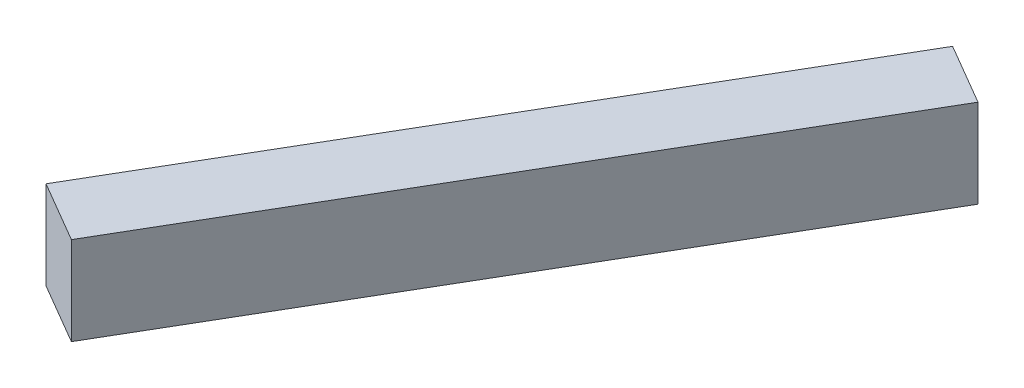
ISO-10303-21;
HEADER;
FILE_DESCRIPTION(('STEP AP214'),'2;1');
FILE_NAME('part.step','',(''),(''),'','','');
FILE_SCHEMA(('AUTOMOTIVE_DESIGN { 1 0 10303 214 1 1 1 1 }'));
ENDSEC;
DATA;
#1=APPLICATION_CONTEXT('core data for automotive mechanical design processes');
#2=APPLICATION_PROTOCOL_DEFINITION('international standard','automotive_design',2000,#1);
#3=PRODUCT_CONTEXT('',#1,'mechanical');
#4=PRODUCT('Part','Part','',(#3));
#5=PRODUCT_RELATED_PRODUCT_CATEGORY('part','',(#4));
#6=PRODUCT_DEFINITION_FORMATION('','',#4);
#7=PRODUCT_DEFINITION_CONTEXT('part definition',#1,'design');
#8=PRODUCT_DEFINITION('design','',#6,#7);
#9=PRODUCT_DEFINITION_SHAPE('','',#8);
#10=(LENGTH_UNIT() NAMED_UNIT(*) SI_UNIT(.MILLI.,.METRE.));
#11=(NAMED_UNIT(*) PLANE_ANGLE_UNIT() SI_UNIT($,.RADIAN.));
#12=(NAMED_UNIT(*) SI_UNIT($,.STERADIAN.) SOLID_ANGLE_UNIT());
#13=UNCERTAINTY_MEASURE_WITH_UNIT(LENGTH_MEASURE(1.E-05),#10,'distance_accuracy_value','');
#14=(GEOMETRIC_REPRESENTATION_CONTEXT(3) GLOBAL_UNCERTAINTY_ASSIGNED_CONTEXT((#13)) GLOBAL_UNIT_ASSIGNED_CONTEXT((#10,
#11,#12)) REPRESENTATION_CONTEXT('',''));
#15=CARTESIAN_POINT('',(0.,0.,0.));
#16=DIRECTION('',(0.,0.,1.));
#17=DIRECTION('',(1.,0.,0.));
#18=AXIS2_PLACEMENT_3D('',#15,#16,#17);
#19=CARTESIAN_POINT('',(-8.98834190536275,7.874,15.5920867685965));
#20=DIRECTION('',(-0.863524672118216,0.,-0.504306593892176));
#21=DIRECTION('',(-0.504306593892176,0.,0.863524672118216));
#22=AXIS2_PLACEMENT_3D('',#19,#20,#21);
#23=PLANE('',#22);
#24=DIRECTION('',(0.,1.,0.));
#25=VECTOR('',#24,1.);
#26=CARTESIAN_POINT('',(-8.98834190536275,7.874,15.5920867685965));
#27=LINE('',#26,#25);
#28=CARTESIAN_POINT('',(-8.98834190536275,7.62,15.5920867685965));
#29=VERTEX_POINT('',#28);
#30=CARTESIAN_POINT('',(-8.98834190536275,7.874,15.5920867685965));
#31=VERTEX_POINT('',#30);
#32=EDGE_CURVE('E20',#29,#31,#27,.T.);
#33=ORIENTED_EDGE('',*,*,#32,.T.);
#34=DIRECTION('',(-0.504306593892174,0.,0.863524672118216));
#35=VECTOR('',#34,1.);
#36=CARTESIAN_POINT('',(-8.98834190536275,7.874,15.5920867685965));
#37=LINE('',#36,#35);
#38=CARTESIAN_POINT('',(-9.94904596672734,7.874,17.2371012689817));
#39=VERTEX_POINT('',#38);
#40=EDGE_CURVE('E55',#31,#39,#37,.T.);
#41=ORIENTED_EDGE('',*,*,#40,.T.);
#42=DIRECTION('',(0.,1.,0.));
#43=VECTOR('',#42,1.);
#44=CARTESIAN_POINT('',(-9.94904596672734,7.874,17.2371012689817));
#45=LINE('',#44,#43);
#46=CARTESIAN_POINT('',(-9.94904596672734,7.62,17.2371012689817));
#47=VERTEX_POINT('',#46);
#48=EDGE_CURVE('E76',#39,#47,#45,.F.);
#49=ORIENTED_EDGE('',*,*,#48,.T.);
#50=DIRECTION('',(-0.504306593892174,0.,0.863524672118216));
#51=VECTOR('',#50,1.);
#52=CARTESIAN_POINT('',(-8.98834190536275,7.62,15.5920867685965));
#53=LINE('',#52,#51);
#54=EDGE_CURVE('E58',#29,#47,#53,.T.);
#55=ORIENTED_EDGE('',*,*,#54,.F.);
#56=EDGE_LOOP('',(#33,#41,#49,#55));
#57=FACE_BOUND('',#56,.T.);
#58=ADVANCED_FACE('F17',(#57),#23,.F.);
#59=CARTESIAN_POINT('',(-8.98834190536275,7.874,15.5920867685965));
#60=DIRECTION('',(-0.504306593892148,0.,0.863524672118232));
#61=DIRECTION('',(0.863524672118232,0.,0.504306593892148));
#62=AXIS2_PLACEMENT_3D('',#59,#60,#61);
#63=PLANE('',#62);
#64=DIRECTION('',(0.,1.,0.));
#65=VECTOR('',#64,1.);
#66=CARTESIAN_POINT('',(-9.16381011873718,7.874,15.4896116687176));
#67=LINE('',#66,#65);
#68=CARTESIAN_POINT('',(-9.16381011873718,7.62,15.4896116687176));
#69=VERTEX_POINT('',#68);
#70=CARTESIAN_POINT('',(-9.16381011873718,7.874,15.4896116687176));
#71=VERTEX_POINT('',#70);
#72=EDGE_CURVE('E73',#69,#71,#67,.T.);
#73=ORIENTED_EDGE('',*,*,#72,.T.);
#74=DIRECTION('',(0.863524672118205,0.,0.504306593892195));
#75=VECTOR('',#74,1.);
#76=CARTESIAN_POINT('',(-9.16381011873718,7.874,15.4896116687176));
#77=LINE('',#76,#75);
#78=EDGE_CURVE('E63',#71,#31,#77,.T.);
#79=ORIENTED_EDGE('',*,*,#78,.T.);
#80=ORIENTED_EDGE('',*,*,#32,.F.);
#81=DIRECTION('',(0.863524672118205,0.,0.504306593892195));
#82=VECTOR('',#81,1.);
#83=CARTESIAN_POINT('',(-9.16381011873718,7.62,15.4896116687176));
#84=LINE('',#83,#82);
#85=EDGE_CURVE('E80',#69,#29,#84,.T.);
#86=ORIENTED_EDGE('',*,*,#85,.F.);
#87=EDGE_LOOP('',(#73,#79,#80,#86));
#88=FACE_BOUND('',#87,.T.);
#89=ADVANCED_FACE('F72',(#88),#63,.F.);
#90=CARTESIAN_POINT('',(-8.98834190536275,7.874,15.5920867685965));
#91=DIRECTION('',(0.,-1.,0.));
#92=DIRECTION('',(0.,0.,-1.));
#93=AXIS2_PLACEMENT_3D('',#90,#91,#92);
#94=PLANE('',#93);
#95=ORIENTED_EDGE('',*,*,#78,.F.);
#96=DIRECTION('',(0.504306593892176,0.,-0.863524672118216));
#97=VECTOR('',#96,1.);
#98=CARTESIAN_POINT('',(-9.16381011873718,7.874,15.4896116687176));
#99=LINE('',#98,#97);
#100=CARTESIAN_POINT('',(-10.1245141802578,7.874,17.1346261693699));
#101=VERTEX_POINT('',#100);
#102=EDGE_CURVE('E83',#71,#101,#99,.F.);
#103=ORIENTED_EDGE('',*,*,#102,.T.);
#104=DIRECTION('',(-0.863524672885935,0.,-0.504306592577609));
#105=VECTOR('',#104,1.);
#106=CARTESIAN_POINT('',(-9.94904596672734,7.874,17.2371012689817));
#107=LINE('',#106,#105);
#108=EDGE_CURVE('E69',#101,#39,#107,.F.);
#109=ORIENTED_EDGE('',*,*,#108,.T.);
#110=ORIENTED_EDGE('',*,*,#40,.F.);
#111=EDGE_LOOP('',(#95,#103,#109,#110));
#112=FACE_BOUND('',#111,.T.);
#113=ADVANCED_FACE('F66',(#112),#94,.F.);
#114=CARTESIAN_POINT('',(-9.94904596672734,7.874,17.2371012689817));
#115=DIRECTION('',(0.504306592577609,0.,-0.863524672885935));
#116=DIRECTION('',(-0.863524672885935,0.,-0.504306592577609));
#117=AXIS2_PLACEMENT_3D('',#114,#115,#116);
#118=PLANE('',#117);
#119=ORIENTED_EDGE('',*,*,#48,.F.);
#120=ORIENTED_EDGE('',*,*,#108,.F.);
#121=DIRECTION('',(0.,1.,0.));
#122=VECTOR('',#121,1.);
#123=CARTESIAN_POINT('',(-10.1245141802578,7.874,17.1346261693699));
#124=LINE('',#123,#122);
#125=CARTESIAN_POINT('',(-10.1245141802578,7.62,17.1346261693699));
#126=VERTEX_POINT('',#125);
#127=EDGE_CURVE('E26',#101,#126,#124,.F.);
#128=ORIENTED_EDGE('',*,*,#127,.T.);
#129=DIRECTION('',(-0.863524672885919,0.,-0.504306592577637));
#130=VECTOR('',#129,1.);
#131=CARTESIAN_POINT('',(-9.94904596672734,7.62,17.2371012689817));
#132=LINE('',#131,#130);
#133=EDGE_CURVE('E34',#47,#126,#132,.T.);
#134=ORIENTED_EDGE('',*,*,#133,.F.);
#135=EDGE_LOOP('',(#119,#120,#128,#134));
#136=FACE_BOUND('',#135,.T.);
#137=ADVANCED_FACE('F88',(#136),#118,.F.);
#138=CARTESIAN_POINT('',(-8.98834190536275,7.62,15.5920867685965));
#139=DIRECTION('',(0.,-1.,0.));
#140=DIRECTION('',(0.,0.,-1.));
#141=AXIS2_PLACEMENT_3D('',#138,#139,#140);
#142=PLANE('',#141);
#143=DIRECTION('',(0.504306593892176,0.,-0.863524672118216));
#144=VECTOR('',#143,1.);
#145=CARTESIAN_POINT('',(-9.16381011873718,7.62,15.4896116687176));
#146=LINE('',#145,#144);
#147=EDGE_CURVE('E11',#126,#69,#146,.T.);
#148=ORIENTED_EDGE('',*,*,#147,.T.);
#149=ORIENTED_EDGE('',*,*,#85,.T.);
#150=ORIENTED_EDGE('',*,*,#54,.T.);
#151=ORIENTED_EDGE('',*,*,#133,.T.);
#152=EDGE_LOOP('',(#148,#149,#150,#151));
#153=FACE_BOUND('',#152,.T.);
#154=ADVANCED_FACE('F91',(#153),#142,.T.);
#155=CARTESIAN_POINT('',(-9.16381011873718,7.874,15.4896116687176));
#156=DIRECTION('',(0.863524672118216,0.,0.504306593892176));
#157=DIRECTION('',(0.504306593892176,0.,-0.863524672118216));
#158=AXIS2_PLACEMENT_3D('',#155,#156,#157);
#159=PLANE('',#158);
#160=ORIENTED_EDGE('',*,*,#127,.F.);
#161=ORIENTED_EDGE('',*,*,#102,.F.);
#162=ORIENTED_EDGE('',*,*,#72,.F.);
#163=ORIENTED_EDGE('',*,*,#147,.F.);
#164=EDGE_LOOP('',(#160,#161,#162,#163));
#165=FACE_BOUND('',#164,.T.);
#166=ADVANCED_FACE('F90',(#165),#159,.F.);
#167=CLOSED_SHELL('',(#58,#89,#113,#137,#154,#166));
#168=MANIFOLD_SOLID_BREP('B1',#167);
#169=ADVANCED_BREP_SHAPE_REPRESENTATION('',(#18,#168),#14);
#170=SHAPE_DEFINITION_REPRESENTATION(#9,#169);
ENDSEC;
END-ISO-10303-21;
